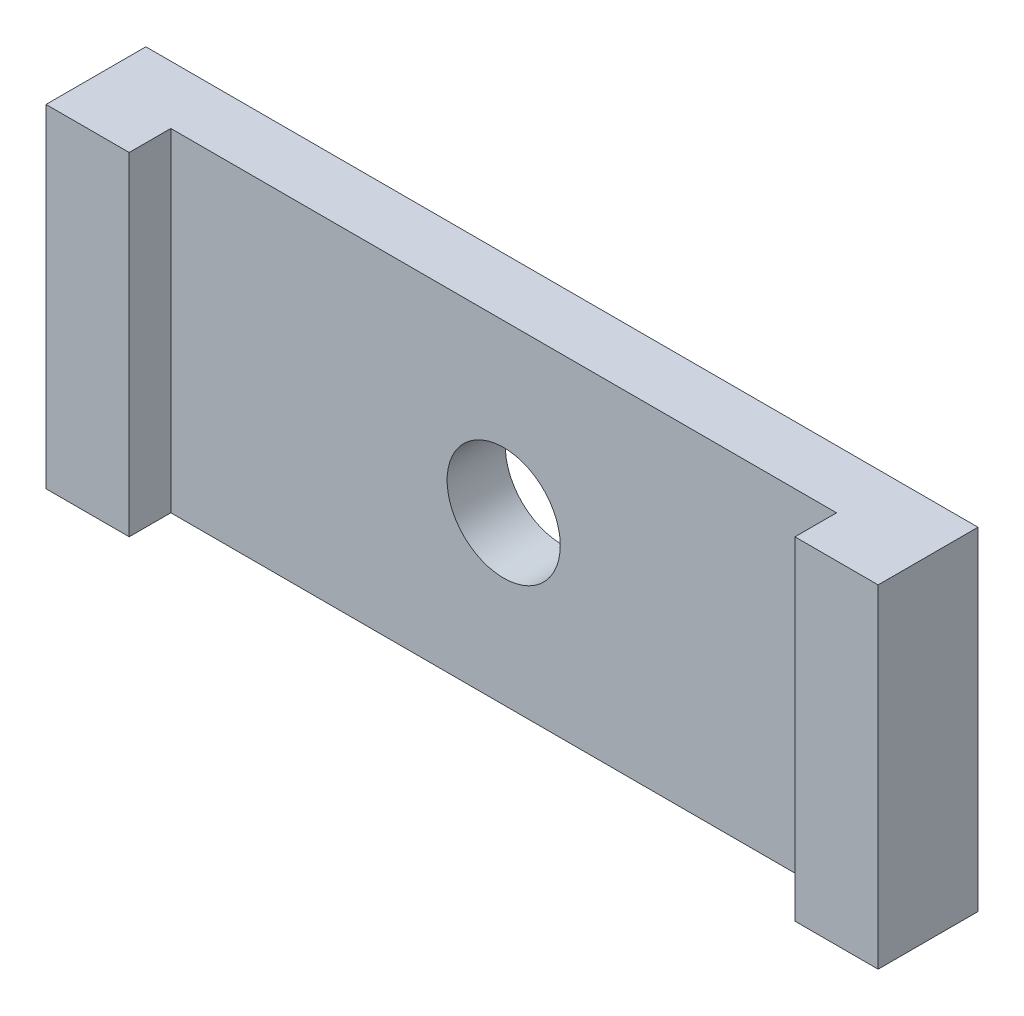
ISO-10303-21;
HEADER;
FILE_DESCRIPTION(('STEP AP214'),'2;1');
FILE_NAME('part.step','',(''),(''),'','','');
FILE_SCHEMA(('AUTOMOTIVE_DESIGN { 1 0 10303 214 1 1 1 1 }'));
ENDSEC;
DATA;
#1=APPLICATION_CONTEXT('core data for automotive mechanical design processes');
#2=APPLICATION_PROTOCOL_DEFINITION('international standard','automotive_design',2000,#1);
#3=PRODUCT_CONTEXT('',#1,'mechanical');
#4=PRODUCT('Part','Part','',(#3));
#5=PRODUCT_RELATED_PRODUCT_CATEGORY('part','',(#4));
#6=PRODUCT_DEFINITION_FORMATION('','',#4);
#7=PRODUCT_DEFINITION_CONTEXT('part definition',#1,'design');
#8=PRODUCT_DEFINITION('design','',#6,#7);
#9=PRODUCT_DEFINITION_SHAPE('','',#8);
#10=(LENGTH_UNIT() NAMED_UNIT(*) SI_UNIT(.MILLI.,.METRE.));
#11=(NAMED_UNIT(*) PLANE_ANGLE_UNIT() SI_UNIT($,.RADIAN.));
#12=(NAMED_UNIT(*) SI_UNIT($,.STERADIAN.) SOLID_ANGLE_UNIT());
#13=UNCERTAINTY_MEASURE_WITH_UNIT(LENGTH_MEASURE(1.E-05),#10,'distance_accuracy_value','');
#14=(GEOMETRIC_REPRESENTATION_CONTEXT(3) GLOBAL_UNCERTAINTY_ASSIGNED_CONTEXT((#13)) GLOBAL_UNIT_ASSIGNED_CONTEXT((#10,
#11,#12)) REPRESENTATION_CONTEXT('',''));
#15=CARTESIAN_POINT('',(0.,0.,0.));
#16=DIRECTION('',(0.,0.,1.));
#17=DIRECTION('',(1.,0.,0.));
#18=AXIS2_PLACEMENT_3D('',#15,#16,#17);
#19=CARTESIAN_POINT('',(0.,20.,-3.5));
#20=DIRECTION('',(0.,0.,-1.));
#21=DIRECTION('',(-1.,0.,0.));
#22=AXIS2_PLACEMENT_3D('',#19,#20,#21);
#23=PLANE('',#22);
#24=CARTESIAN_POINT('',(20.,10.,-3.5));
#25=DIRECTION('',(0.,0.,1.));
#26=DIRECTION('',(1.,0.,0.));
#27=AXIS2_PLACEMENT_3D('',#24,#25,#26);
#28=CIRCLE('',#27,3.4);
#29=CARTESIAN_POINT('',(23.4,10.,-3.5));
#30=VERTEX_POINT('',#29);
#31=EDGE_CURVE('E133',#30,#30,#28,.T.);
#32=ORIENTED_EDGE('',*,*,#31,.T.);
#33=EDGE_LOOP('',(#32));
#34=FACE_BOUND('',#33,.T.);
#35=DIRECTION('',(1.,0.,0.));
#36=VECTOR('',#35,1.);
#37=CARTESIAN_POINT('',(0.,0.,-3.5));
#38=LINE('',#37,#36);
#39=CARTESIAN_POINT('',(-5.,0.,-3.5));
#40=VERTEX_POINT('',#39);
#41=CARTESIAN_POINT('',(45.,0.,-3.50000000000001));
#42=VERTEX_POINT('',#41);
#43=EDGE_CURVE('E129',#40,#42,#38,.T.);
#44=ORIENTED_EDGE('',*,*,#43,.F.);
#45=DIRECTION('',(0.,-1.,0.));
#46=VECTOR('',#45,1.);
#47=CARTESIAN_POINT('',(-5.,20.,-3.5));
#48=LINE('',#47,#46);
#49=CARTESIAN_POINT('',(-5.,20.,-3.5));
#50=VERTEX_POINT('',#49);
#51=EDGE_CURVE('E11',#50,#40,#48,.T.);
#52=ORIENTED_EDGE('',*,*,#51,.F.);
#53=DIRECTION('',(1.,0.,0.));
#54=VECTOR('',#53,1.);
#55=CARTESIAN_POINT('',(0.,20.,-3.5));
#56=LINE('',#55,#54);
#57=CARTESIAN_POINT('',(45.,20.,-3.50000000000001));
#58=VERTEX_POINT('',#57);
#59=EDGE_CURVE('E148',#50,#58,#56,.T.);
#60=ORIENTED_EDGE('',*,*,#59,.T.);
#61=DIRECTION('',(0.,-1.,0.));
#62=VECTOR('',#61,1.);
#63=CARTESIAN_POINT('',(45.,20.,-3.50000000000001));
#64=LINE('',#63,#62);
#65=EDGE_CURVE('E87',#58,#42,#64,.T.);
#66=ORIENTED_EDGE('',*,*,#65,.T.);
#67=EDGE_LOOP('',(#44,#52,#60,#66));
#68=FACE_BOUND('',#67,.T.);
#69=ADVANCED_FACE('F36',(#34,#68),#23,.T.);
#70=CARTESIAN_POINT('',(-5.,20.,0.));
#71=DIRECTION('',(-1.,0.,0.));
#72=DIRECTION('',(0.,0.,1.));
#73=AXIS2_PLACEMENT_3D('',#70,#71,#72);
#74=PLANE('',#73);
#75=DIRECTION('',(0.,0.,-1.));
#76=VECTOR('',#75,1.);
#77=CARTESIAN_POINT('',(-5.,0.,0.));
#78=LINE('',#77,#76);
#79=CARTESIAN_POINT('',(-5.,0.,2.5));
#80=VERTEX_POINT('',#79);
#81=EDGE_CURVE('E132',#80,#40,#78,.T.);
#82=ORIENTED_EDGE('',*,*,#81,.F.);
#83=DIRECTION('',(0.,-1.,0.));
#84=VECTOR('',#83,1.);
#85=CARTESIAN_POINT('',(-5.,20.,2.5));
#86=LINE('',#85,#84);
#87=CARTESIAN_POINT('',(-5.,20.,2.5));
#88=VERTEX_POINT('',#87);
#89=EDGE_CURVE('E44',#88,#80,#86,.T.);
#90=ORIENTED_EDGE('',*,*,#89,.F.);
#91=DIRECTION('',(0.,0.,-1.));
#92=VECTOR('',#91,1.);
#93=CARTESIAN_POINT('',(-5.,20.,0.));
#94=LINE('',#93,#92);
#95=EDGE_CURVE('E174',#88,#50,#94,.T.);
#96=ORIENTED_EDGE('',*,*,#95,.T.);
#97=ORIENTED_EDGE('',*,*,#51,.T.);
#98=EDGE_LOOP('',(#82,#90,#96,#97));
#99=FACE_BOUND('',#98,.T.);
#100=ADVANCED_FACE('F165',(#99),#74,.T.);
#101=CARTESIAN_POINT('',(0.,20.,2.5));
#102=DIRECTION('',(0.,0.,1.));
#103=DIRECTION('',(1.,0.,0.));
#104=AXIS2_PLACEMENT_3D('',#101,#102,#103);
#105=PLANE('',#104);
#106=DIRECTION('',(-1.,0.,0.));
#107=VECTOR('',#106,1.);
#108=CARTESIAN_POINT('',(0.,0.,2.5));
#109=LINE('',#108,#107);
#110=CARTESIAN_POINT('',(0.,0.,2.5));
#111=VERTEX_POINT('',#110);
#112=EDGE_CURVE('E136',#111,#80,#109,.T.);
#113=ORIENTED_EDGE('',*,*,#112,.F.);
#114=DIRECTION('',(0.,-1.,0.));
#115=VECTOR('',#114,1.);
#116=CARTESIAN_POINT('',(0.,20.,2.5));
#117=LINE('',#116,#115);
#118=CARTESIAN_POINT('',(0.,20.,2.5));
#119=VERTEX_POINT('',#118);
#120=EDGE_CURVE('E154',#119,#111,#117,.T.);
#121=ORIENTED_EDGE('',*,*,#120,.F.);
#122=DIRECTION('',(-1.,0.,0.));
#123=VECTOR('',#122,1.);
#124=CARTESIAN_POINT('',(0.,20.,2.5));
#125=LINE('',#124,#123);
#126=EDGE_CURVE('E161',#119,#88,#125,.T.);
#127=ORIENTED_EDGE('',*,*,#126,.T.);
#128=ORIENTED_EDGE('',*,*,#89,.T.);
#129=EDGE_LOOP('',(#113,#121,#127,#128));
#130=FACE_BOUND('',#129,.T.);
#131=ADVANCED_FACE('F159',(#130),#105,.T.);
#132=CARTESIAN_POINT('',(0.,20.,0.));
#133=DIRECTION('',(1.,0.,0.));
#134=DIRECTION('',(0.,0.,-1.));
#135=AXIS2_PLACEMENT_3D('',#132,#133,#134);
#136=PLANE('',#135);
#137=DIRECTION('',(0.,0.,1.));
#138=VECTOR('',#137,1.);
#139=CARTESIAN_POINT('',(0.,0.,0.));
#140=LINE('',#139,#138);
#141=CARTESIAN_POINT('',(0.,0.,0.));
#142=VERTEX_POINT('',#141);
#143=EDGE_CURVE('E139',#142,#111,#140,.T.);
#144=ORIENTED_EDGE('',*,*,#143,.F.);
#145=DIRECTION('',(0.,-1.,0.));
#146=VECTOR('',#145,1.);
#147=CARTESIAN_POINT('',(0.,20.,0.));
#148=LINE('',#147,#146);
#149=CARTESIAN_POINT('',(0.,20.,0.));
#150=VERTEX_POINT('',#149);
#151=EDGE_CURVE('E152',#150,#142,#148,.T.);
#152=ORIENTED_EDGE('',*,*,#151,.F.);
#153=DIRECTION('',(0.,0.,1.));
#154=VECTOR('',#153,1.);
#155=CARTESIAN_POINT('',(0.,20.,0.));
#156=LINE('',#155,#154);
#157=EDGE_CURVE('E173',#150,#119,#156,.T.);
#158=ORIENTED_EDGE('',*,*,#157,.T.);
#159=ORIENTED_EDGE('',*,*,#120,.T.);
#160=EDGE_LOOP('',(#144,#152,#158,#159));
#161=FACE_BOUND('',#160,.T.);
#162=ADVANCED_FACE('F171',(#161),#136,.T.);
#163=CARTESIAN_POINT('',(0.,20.,0.));
#164=DIRECTION('',(0.,0.,-1.));
#165=DIRECTION('',(-1.,0.,0.));
#166=AXIS2_PLACEMENT_3D('',#163,#164,#165);
#167=PLANE('',#166);
#168=CARTESIAN_POINT('',(20.,10.,0.));
#169=DIRECTION('',(0.,0.,1.));
#170=DIRECTION('',(1.,0.,0.));
#171=AXIS2_PLACEMENT_3D('',#168,#169,#170);
#172=CIRCLE('',#171,3.39999999999999);
#173=CARTESIAN_POINT('',(23.4,10.,0.));
#174=VERTEX_POINT('',#173);
#175=EDGE_CURVE('E182',#174,#174,#172,.T.);
#176=ORIENTED_EDGE('',*,*,#175,.F.);
#177=EDGE_LOOP('',(#176));
#178=FACE_BOUND('',#177,.T.);
#179=DIRECTION('',(1.,0.,0.));
#180=VECTOR('',#179,1.);
#181=CARTESIAN_POINT('',(0.,0.,0.));
#182=LINE('',#181,#180);
#183=CARTESIAN_POINT('',(40.,0.,0.));
#184=VERTEX_POINT('',#183);
#185=EDGE_CURVE('E142',#142,#184,#182,.T.);
#186=ORIENTED_EDGE('',*,*,#185,.T.);
#187=DIRECTION('',(0.,-1.,0.));
#188=VECTOR('',#187,1.);
#189=CARTESIAN_POINT('',(40.,20.,0.));
#190=LINE('',#189,#188);
#191=CARTESIAN_POINT('',(40.,20.,0.));
#192=VERTEX_POINT('',#191);
#193=EDGE_CURVE('E121',#192,#184,#190,.T.);
#194=ORIENTED_EDGE('',*,*,#193,.F.);
#195=DIRECTION('',(1.,0.,0.));
#196=VECTOR('',#195,1.);
#197=CARTESIAN_POINT('',(0.,20.,0.));
#198=LINE('',#197,#196);
#199=EDGE_CURVE('E112',#150,#192,#198,.T.);
#200=ORIENTED_EDGE('',*,*,#199,.F.);
#201=ORIENTED_EDGE('',*,*,#151,.T.);
#202=EDGE_LOOP('',(#186,#194,#200,#201));
#203=FACE_BOUND('',#202,.T.);
#204=ADVANCED_FACE('F188',(#178,#203),#167,.F.);
#205=CARTESIAN_POINT('',(40.,20.,0.));
#206=DIRECTION('',(1.,0.,0.));
#207=DIRECTION('',(0.,0.,-1.));
#208=AXIS2_PLACEMENT_3D('',#205,#206,#207);
#209=PLANE('',#208);
#210=DIRECTION('',(0.,0.,1.));
#211=VECTOR('',#210,1.);
#212=CARTESIAN_POINT('',(40.,0.,0.));
#213=LINE('',#212,#211);
#214=CARTESIAN_POINT('',(40.,0.,2.5));
#215=VERTEX_POINT('',#214);
#216=EDGE_CURVE('E120',#184,#215,#213,.T.);
#217=ORIENTED_EDGE('',*,*,#216,.T.);
#218=DIRECTION('',(0.,-1.,0.));
#219=VECTOR('',#218,1.);
#220=CARTESIAN_POINT('',(40.,20.,2.5));
#221=LINE('',#220,#219);
#222=CARTESIAN_POINT('',(40.,20.,2.5));
#223=VERTEX_POINT('',#222);
#224=EDGE_CURVE('E117',#223,#215,#221,.T.);
#225=ORIENTED_EDGE('',*,*,#224,.F.);
#226=DIRECTION('',(0.,0.,1.));
#227=VECTOR('',#226,1.);
#228=CARTESIAN_POINT('',(40.,20.,0.));
#229=LINE('',#228,#227);
#230=EDGE_CURVE('E105',#192,#223,#229,.T.);
#231=ORIENTED_EDGE('',*,*,#230,.F.);
#232=ORIENTED_EDGE('',*,*,#193,.T.);
#233=EDGE_LOOP('',(#217,#225,#231,#232));
#234=FACE_BOUND('',#233,.T.);
#235=ADVANCED_FACE('F118',(#234),#209,.F.);
#236=CARTESIAN_POINT('',(0.,20.,2.5));
#237=DIRECTION('',(0.,0.,-1.));
#238=DIRECTION('',(-1.,0.,0.));
#239=AXIS2_PLACEMENT_3D('',#236,#237,#238);
#240=PLANE('',#239);
#241=DIRECTION('',(1.,0.,0.));
#242=VECTOR('',#241,1.);
#243=CARTESIAN_POINT('',(0.,0.,2.5));
#244=LINE('',#243,#242);
#245=CARTESIAN_POINT('',(45.,0.,2.49999999999999));
#246=VERTEX_POINT('',#245);
#247=EDGE_CURVE('E80',#215,#246,#244,.T.);
#248=ORIENTED_EDGE('',*,*,#247,.T.);
#249=DIRECTION('',(0.,-1.,0.));
#250=VECTOR('',#249,1.);
#251=CARTESIAN_POINT('',(45.,20.,2.49999999999999));
#252=LINE('',#251,#250);
#253=CARTESIAN_POINT('',(45.,20.,2.49999999999999));
#254=VERTEX_POINT('',#253);
#255=EDGE_CURVE('E122',#254,#246,#252,.T.);
#256=ORIENTED_EDGE('',*,*,#255,.F.);
#257=DIRECTION('',(1.,0.,0.));
#258=VECTOR('',#257,1.);
#259=CARTESIAN_POINT('',(0.,20.,2.5));
#260=LINE('',#259,#258);
#261=EDGE_CURVE('E109',#223,#254,#260,.T.);
#262=ORIENTED_EDGE('',*,*,#261,.F.);
#263=ORIENTED_EDGE('',*,*,#224,.T.);
#264=EDGE_LOOP('',(#248,#256,#262,#263));
#265=FACE_BOUND('',#264,.T.);
#266=ADVANCED_FACE('F124',(#265),#240,.F.);
#267=CARTESIAN_POINT('',(45.,20.,0.));
#268=DIRECTION('',(-1.,0.,0.));
#269=DIRECTION('',(0.,0.,1.));
#270=AXIS2_PLACEMENT_3D('',#267,#268,#269);
#271=PLANE('',#270);
#272=DIRECTION('',(0.,0.,-1.));
#273=VECTOR('',#272,1.);
#274=CARTESIAN_POINT('',(45.,0.,0.));
#275=LINE('',#274,#273);
#276=EDGE_CURVE('E146',#246,#42,#275,.T.);
#277=ORIENTED_EDGE('',*,*,#276,.T.);
#278=ORIENTED_EDGE('',*,*,#65,.F.);
#279=DIRECTION('',(0.,0.,-1.));
#280=VECTOR('',#279,1.);
#281=CARTESIAN_POINT('',(45.,20.,0.));
#282=LINE('',#281,#280);
#283=EDGE_CURVE('E52',#254,#58,#282,.T.);
#284=ORIENTED_EDGE('',*,*,#283,.F.);
#285=ORIENTED_EDGE('',*,*,#255,.T.);
#286=EDGE_LOOP('',(#277,#278,#284,#285));
#287=FACE_BOUND('',#286,.T.);
#288=ADVANCED_FACE('F194',(#287),#271,.F.);
#289=CARTESIAN_POINT('',(0.,20.,0.));
#290=DIRECTION('',(0.,1.,0.));
#291=DIRECTION('',(0.,0.,1.));
#292=AXIS2_PLACEMENT_3D('',#289,#290,#291);
#293=PLANE('',#292);
#294=ORIENTED_EDGE('',*,*,#59,.F.);
#295=ORIENTED_EDGE('',*,*,#95,.F.);
#296=ORIENTED_EDGE('',*,*,#126,.F.);
#297=ORIENTED_EDGE('',*,*,#157,.F.);
#298=ORIENTED_EDGE('',*,*,#199,.T.);
#299=ORIENTED_EDGE('',*,*,#230,.T.);
#300=ORIENTED_EDGE('',*,*,#261,.T.);
#301=ORIENTED_EDGE('',*,*,#283,.T.);
#302=EDGE_LOOP('',(#294,#295,#296,#297,#298,#299,#300,#301));
#303=FACE_BOUND('',#302,.T.);
#304=ADVANCED_FACE('F107',(#303),#293,.T.);
#305=CARTESIAN_POINT('',(0.,0.,0.));
#306=DIRECTION('',(0.,1.,0.));
#307=DIRECTION('',(0.,0.,1.));
#308=AXIS2_PLACEMENT_3D('',#305,#306,#307);
#309=PLANE('',#308);
#310=ORIENTED_EDGE('',*,*,#43,.T.);
#311=ORIENTED_EDGE('',*,*,#276,.F.);
#312=ORIENTED_EDGE('',*,*,#247,.F.);
#313=ORIENTED_EDGE('',*,*,#216,.F.);
#314=ORIENTED_EDGE('',*,*,#185,.F.);
#315=ORIENTED_EDGE('',*,*,#143,.T.);
#316=ORIENTED_EDGE('',*,*,#112,.T.);
#317=ORIENTED_EDGE('',*,*,#81,.T.);
#318=EDGE_LOOP('',(#310,#311,#312,#313,#314,#315,#316,#317));
#319=FACE_BOUND('',#318,.T.);
#320=ADVANCED_FACE('F167',(#319),#309,.F.);
#321=CARTESIAN_POINT('',(20.,10.,0.));
#322=DIRECTION('',(0.,0.,1.));
#323=DIRECTION('',(1.,0.,0.));
#324=AXIS2_PLACEMENT_3D('',#321,#322,#323);
#325=CYLINDRICAL_SURFACE('',#324,3.39999999999999);
#326=ORIENTED_EDGE('',*,*,#31,.F.);
#327=EDGE_LOOP('',(#326));
#328=FACE_BOUND('',#327,.T.);
#329=ORIENTED_EDGE('',*,*,#175,.T.);
#330=EDGE_LOOP('',(#329));
#331=FACE_BOUND('',#330,.T.);
#332=ADVANCED_FACE('F186',(#328,#331),#325,.F.);
#333=CLOSED_SHELL('',(#69,#100,#131,#162,#204,#235,#266,#288,#304,#320,#332));
#334=MANIFOLD_SOLID_BREP('B2',#333);
#335=ADVANCED_BREP_SHAPE_REPRESENTATION('',(#18,#334),#14);
#336=SHAPE_DEFINITION_REPRESENTATION(#9,#335);
ENDSEC;
END-ISO-10303-21;
